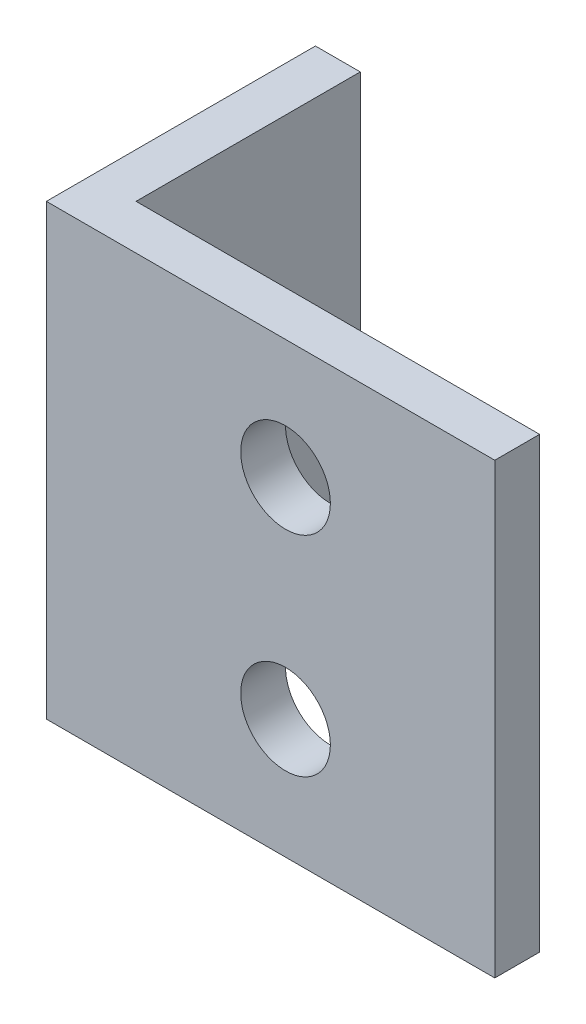
ISO-10303-21;
HEADER;
FILE_DESCRIPTION(('STEP AP214'),'2;1');
FILE_NAME('part.step','',(''),(''),'','','');
FILE_SCHEMA(('AUTOMOTIVE_DESIGN { 1 0 10303 214 1 1 1 1 }'));
ENDSEC;
DATA;
#1=APPLICATION_CONTEXT('core data for automotive mechanical design processes');
#2=APPLICATION_PROTOCOL_DEFINITION('international standard','automotive_design',2000,#1);
#3=PRODUCT_CONTEXT('',#1,'mechanical');
#4=PRODUCT('Part','Part','',(#3));
#5=PRODUCT_RELATED_PRODUCT_CATEGORY('part','',(#4));
#6=PRODUCT_DEFINITION_FORMATION('','',#4);
#7=PRODUCT_DEFINITION_CONTEXT('part definition',#1,'design');
#8=PRODUCT_DEFINITION('design','',#6,#7);
#9=PRODUCT_DEFINITION_SHAPE('','',#8);
#10=(LENGTH_UNIT() NAMED_UNIT(*) SI_UNIT(.MILLI.,.METRE.));
#11=(NAMED_UNIT(*) PLANE_ANGLE_UNIT() SI_UNIT($,.RADIAN.));
#12=(NAMED_UNIT(*) SI_UNIT($,.STERADIAN.) SOLID_ANGLE_UNIT());
#13=UNCERTAINTY_MEASURE_WITH_UNIT(LENGTH_MEASURE(1.E-05),#10,'distance_accuracy_value','');
#14=(GEOMETRIC_REPRESENTATION_CONTEXT(3) GLOBAL_UNCERTAINTY_ASSIGNED_CONTEXT((#13)) GLOBAL_UNIT_ASSIGNED_CONTEXT((#10,
#11,#12)) REPRESENTATION_CONTEXT('',''));
#15=CARTESIAN_POINT('',(0.,0.,0.));
#16=DIRECTION('',(0.,0.,1.));
#17=DIRECTION('',(1.,0.,0.));
#18=AXIS2_PLACEMENT_3D('',#15,#16,#17);
#19=CARTESIAN_POINT('',(-18.0197816219261,15.,0.));
#20=DIRECTION('',(0.,0.,-1.));
#21=DIRECTION('',(-1.,0.,0.));
#22=AXIS2_PLACEMENT_3D('',#19,#20,#21);
#23=PLANE('',#22);
#24=CARTESIAN_POINT('',(-25.0197816219261,4.,0.));
#25=DIRECTION('',(0.,0.,1.));
#26=DIRECTION('',(1.,0.,0.));
#27=AXIS2_PLACEMENT_3D('',#24,#25,#26);
#28=CIRCLE('',#27,1.5);
#29=CARTESIAN_POINT('',(-23.5197816219261,4.,0.));
#30=VERTEX_POINT('',#29);
#31=EDGE_CURVE('E142',#30,#30,#28,.T.);
#32=ORIENTED_EDGE('',*,*,#31,.F.);
#33=EDGE_LOOP('',(#32));
#34=FACE_BOUND('',#33,.T.);
#35=CARTESIAN_POINT('',(-25.0197816219261,11.,0.));
#36=DIRECTION('',(0.,0.,1.));
#37=DIRECTION('',(1.,0.,0.));
#38=AXIS2_PLACEMENT_3D('',#35,#36,#37);
#39=CIRCLE('',#38,1.5);
#40=CARTESIAN_POINT('',(-23.5197816219261,11.,0.));
#41=VERTEX_POINT('',#40);
#42=EDGE_CURVE('E134',#41,#41,#39,.T.);
#43=ORIENTED_EDGE('',*,*,#42,.F.);
#44=EDGE_LOOP('',(#43));
#45=FACE_BOUND('',#44,.T.);
#46=DIRECTION('',(1.,0.,0.));
#47=VECTOR('',#46,1.);
#48=CARTESIAN_POINT('',(-18.0197816219261,0.,0.));
#49=LINE('',#48,#47);
#50=CARTESIAN_POINT('',(-33.0197816219261,0.,0.));
#51=VERTEX_POINT('',#50);
#52=CARTESIAN_POINT('',(-18.0197816219261,0.,0.));
#53=VERTEX_POINT('',#52);
#54=EDGE_CURVE('E117',#51,#53,#49,.T.);
#55=ORIENTED_EDGE('',*,*,#54,.T.);
#56=DIRECTION('',(0.,-1.,0.));
#57=VECTOR('',#56,1.);
#58=CARTESIAN_POINT('',(-18.0197816219261,15.,0.));
#59=LINE('',#58,#57);
#60=CARTESIAN_POINT('',(-18.0197816219261,15.,0.));
#61=VERTEX_POINT('',#60);
#62=EDGE_CURVE('E11',#61,#53,#59,.T.);
#63=ORIENTED_EDGE('',*,*,#62,.F.);
#64=DIRECTION('',(1.,0.,0.));
#65=VECTOR('',#64,1.);
#66=CARTESIAN_POINT('',(-18.0197816219261,15.,0.));
#67=LINE('',#66,#65);
#68=CARTESIAN_POINT('',(-33.0197816219261,15.,0.));
#69=VERTEX_POINT('',#68);
#70=EDGE_CURVE('E128',#69,#61,#67,.T.);
#71=ORIENTED_EDGE('',*,*,#70,.F.);
#72=DIRECTION('',(0.,-1.,0.));
#73=VECTOR('',#72,1.);
#74=CARTESIAN_POINT('',(-33.0197816219261,15.,0.));
#75=LINE('',#74,#73);
#76=EDGE_CURVE('E113',#69,#51,#75,.T.);
#77=ORIENTED_EDGE('',*,*,#76,.T.);
#78=EDGE_LOOP('',(#55,#63,#71,#77));
#79=FACE_BOUND('',#78,.T.);
#80=ADVANCED_FACE('F31',(#34,#45,#79),#23,.F.);
#81=CARTESIAN_POINT('',(-18.0197816219261,15.,-1.5));
#82=DIRECTION('',(-1.,0.,0.));
#83=DIRECTION('',(0.,0.,1.));
#84=AXIS2_PLACEMENT_3D('',#81,#82,#83);
#85=PLANE('',#84);
#86=DIRECTION('',(0.,0.,-1.));
#87=VECTOR('',#86,1.);
#88=CARTESIAN_POINT('',(-18.0197816219261,0.,-1.5));
#89=LINE('',#88,#87);
#90=CARTESIAN_POINT('',(-18.0197816219261,0.,-1.5));
#91=VERTEX_POINT('',#90);
#92=EDGE_CURVE('E120',#53,#91,#89,.T.);
#93=ORIENTED_EDGE('',*,*,#92,.T.);
#94=DIRECTION('',(0.,-1.,0.));
#95=VECTOR('',#94,1.);
#96=CARTESIAN_POINT('',(-18.0197816219261,15.,-1.5));
#97=LINE('',#96,#95);
#98=CARTESIAN_POINT('',(-18.0197816219261,15.,-1.5));
#99=VERTEX_POINT('',#98);
#100=EDGE_CURVE('E40',#99,#91,#97,.T.);
#101=ORIENTED_EDGE('',*,*,#100,.F.);
#102=DIRECTION('',(0.,0.,-1.));
#103=VECTOR('',#102,1.);
#104=CARTESIAN_POINT('',(-18.0197816219261,15.,-1.5));
#105=LINE('',#104,#103);
#106=EDGE_CURVE('E86',#61,#99,#105,.T.);
#107=ORIENTED_EDGE('',*,*,#106,.F.);
#108=ORIENTED_EDGE('',*,*,#62,.T.);
#109=EDGE_LOOP('',(#93,#101,#107,#108));
#110=FACE_BOUND('',#109,.T.);
#111=ADVANCED_FACE('F148',(#110),#85,.F.);
#112=CARTESIAN_POINT('',(-31.5197816219261,15.,-1.5));
#113=DIRECTION('',(0.,0.,1.));
#114=DIRECTION('',(1.,0.,0.));
#115=AXIS2_PLACEMENT_3D('',#112,#113,#114);
#116=PLANE('',#115);
#117=CARTESIAN_POINT('',(-25.0197816219261,4.,-1.5));
#118=DIRECTION('',(0.,0.,1.));
#119=DIRECTION('',(1.,0.,0.));
#120=AXIS2_PLACEMENT_3D('',#117,#118,#119);
#121=CIRCLE('',#120,1.5);
#122=CARTESIAN_POINT('',(-23.5197816219261,4.,-1.5));
#123=VERTEX_POINT('',#122);
#124=EDGE_CURVE('E34',#123,#123,#121,.T.);
#125=ORIENTED_EDGE('',*,*,#124,.T.);
#126=EDGE_LOOP('',(#125));
#127=FACE_BOUND('',#126,.T.);
#128=CARTESIAN_POINT('',(-25.0197816219261,11.,-1.5));
#129=DIRECTION('',(0.,0.,1.));
#130=DIRECTION('',(1.,0.,0.));
#131=AXIS2_PLACEMENT_3D('',#128,#129,#130);
#132=CIRCLE('',#131,1.5);
#133=CARTESIAN_POINT('',(-23.5197816219261,11.,-1.5));
#134=VERTEX_POINT('',#133);
#135=EDGE_CURVE('E121',#134,#134,#132,.T.);
#136=ORIENTED_EDGE('',*,*,#135,.T.);
#137=EDGE_LOOP('',(#136));
#138=FACE_BOUND('',#137,.T.);
#139=DIRECTION('',(-1.,0.,0.));
#140=VECTOR('',#139,1.);
#141=CARTESIAN_POINT('',(-31.5197816219261,0.,-1.5));
#142=LINE('',#141,#140);
#143=CARTESIAN_POINT('',(-31.5197816219261,0.,-1.5));
#144=VERTEX_POINT('',#143);
#145=EDGE_CURVE('E123',#91,#144,#142,.T.);
#146=ORIENTED_EDGE('',*,*,#145,.T.);
#147=DIRECTION('',(0.,-1.,0.));
#148=VECTOR('',#147,1.);
#149=CARTESIAN_POINT('',(-31.5197816219261,15.,-1.5));
#150=LINE('',#149,#148);
#151=CARTESIAN_POINT('',(-31.5197816219261,15.,-1.5));
#152=VERTEX_POINT('',#151);
#153=EDGE_CURVE('E108',#152,#144,#150,.T.);
#154=ORIENTED_EDGE('',*,*,#153,.F.);
#155=DIRECTION('',(-1.,0.,0.));
#156=VECTOR('',#155,1.);
#157=CARTESIAN_POINT('',(-31.5197816219261,15.,-1.5));
#158=LINE('',#157,#156);
#159=EDGE_CURVE('E99',#99,#152,#158,.T.);
#160=ORIENTED_EDGE('',*,*,#159,.F.);
#161=ORIENTED_EDGE('',*,*,#100,.T.);
#162=EDGE_LOOP('',(#146,#154,#160,#161));
#163=FACE_BOUND('',#162,.T.);
#164=ADVANCED_FACE('F151',(#127,#138,#163),#116,.F.);
#165=CARTESIAN_POINT('',(-31.5197816219261,15.,-9.));
#166=DIRECTION('',(-1.,0.,0.));
#167=DIRECTION('',(0.,0.,1.));
#168=AXIS2_PLACEMENT_3D('',#165,#166,#167);
#169=PLANE('',#168);
#170=DIRECTION('',(0.,0.,-1.));
#171=VECTOR('',#170,1.);
#172=CARTESIAN_POINT('',(-31.5197816219261,0.,-9.));
#173=LINE('',#172,#171);
#174=CARTESIAN_POINT('',(-31.5197816219261,0.,-9.));
#175=VERTEX_POINT('',#174);
#176=EDGE_CURVE('E107',#144,#175,#173,.T.);
#177=ORIENTED_EDGE('',*,*,#176,.T.);
#178=DIRECTION('',(0.,-1.,0.));
#179=VECTOR('',#178,1.);
#180=CARTESIAN_POINT('',(-31.5197816219261,15.,-9.));
#181=LINE('',#180,#179);
#182=CARTESIAN_POINT('',(-31.5197816219261,15.,-9.));
#183=VERTEX_POINT('',#182);
#184=EDGE_CURVE('E104',#183,#175,#181,.T.);
#185=ORIENTED_EDGE('',*,*,#184,.F.);
#186=DIRECTION('',(0.,0.,-1.));
#187=VECTOR('',#186,1.);
#188=CARTESIAN_POINT('',(-31.5197816219261,15.,-9.));
#189=LINE('',#188,#187);
#190=EDGE_CURVE('E93',#152,#183,#189,.T.);
#191=ORIENTED_EDGE('',*,*,#190,.F.);
#192=ORIENTED_EDGE('',*,*,#153,.T.);
#193=EDGE_LOOP('',(#177,#185,#191,#192));
#194=FACE_BOUND('',#193,.T.);
#195=ADVANCED_FACE('F105',(#194),#169,.F.);
#196=CARTESIAN_POINT('',(-33.0197816219261,15.,-9.));
#197=DIRECTION('',(0.,0.,1.));
#198=DIRECTION('',(1.,0.,0.));
#199=AXIS2_PLACEMENT_3D('',#196,#197,#198);
#200=PLANE('',#199);
#201=DIRECTION('',(-1.,0.,0.));
#202=VECTOR('',#201,1.);
#203=CARTESIAN_POINT('',(-33.0197816219261,0.,-9.));
#204=LINE('',#203,#202);
#205=CARTESIAN_POINT('',(-33.0197816219261,0.,-9.));
#206=VERTEX_POINT('',#205);
#207=EDGE_CURVE('E72',#175,#206,#204,.T.);
#208=ORIENTED_EDGE('',*,*,#207,.T.);
#209=DIRECTION('',(0.,-1.,0.));
#210=VECTOR('',#209,1.);
#211=CARTESIAN_POINT('',(-33.0197816219261,15.,-9.));
#212=LINE('',#211,#210);
#213=CARTESIAN_POINT('',(-33.0197816219261,15.,-9.));
#214=VERTEX_POINT('',#213);
#215=EDGE_CURVE('E109',#214,#206,#212,.T.);
#216=ORIENTED_EDGE('',*,*,#215,.F.);
#217=DIRECTION('',(-1.,0.,0.));
#218=VECTOR('',#217,1.);
#219=CARTESIAN_POINT('',(-33.0197816219261,15.,-9.));
#220=LINE('',#219,#218);
#221=EDGE_CURVE('E97',#183,#214,#220,.T.);
#222=ORIENTED_EDGE('',*,*,#221,.F.);
#223=ORIENTED_EDGE('',*,*,#184,.T.);
#224=EDGE_LOOP('',(#208,#216,#222,#223));
#225=FACE_BOUND('',#224,.T.);
#226=ADVANCED_FACE('F111',(#225),#200,.F.);
#227=CARTESIAN_POINT('',(-33.0197816219261,15.,0.));
#228=DIRECTION('',(1.,0.,0.));
#229=DIRECTION('',(0.,0.,-1.));
#230=AXIS2_PLACEMENT_3D('',#227,#228,#229);
#231=PLANE('',#230);
#232=DIRECTION('',(0.,0.,1.));
#233=VECTOR('',#232,1.);
#234=CARTESIAN_POINT('',(-33.0197816219261,0.,0.));
#235=LINE('',#234,#233);
#236=EDGE_CURVE('E78',#206,#51,#235,.T.);
#237=ORIENTED_EDGE('',*,*,#236,.T.);
#238=ORIENTED_EDGE('',*,*,#76,.F.);
#239=DIRECTION('',(0.,0.,1.));
#240=VECTOR('',#239,1.);
#241=CARTESIAN_POINT('',(-33.0197816219261,15.,0.));
#242=LINE('',#241,#240);
#243=EDGE_CURVE('E49',#214,#69,#242,.T.);
#244=ORIENTED_EDGE('',*,*,#243,.F.);
#245=ORIENTED_EDGE('',*,*,#215,.T.);
#246=EDGE_LOOP('',(#237,#238,#244,#245));
#247=FACE_BOUND('',#246,.T.);
#248=ADVANCED_FACE('F156',(#247),#231,.F.);
#249=CARTESIAN_POINT('',(-33.0197816219261,15.,0.));
#250=DIRECTION('',(0.,-1.,0.));
#251=DIRECTION('',(0.,0.,-1.));
#252=AXIS2_PLACEMENT_3D('',#249,#250,#251);
#253=PLANE('',#252);
#254=ORIENTED_EDGE('',*,*,#70,.T.);
#255=ORIENTED_EDGE('',*,*,#106,.T.);
#256=ORIENTED_EDGE('',*,*,#159,.T.);
#257=ORIENTED_EDGE('',*,*,#190,.T.);
#258=ORIENTED_EDGE('',*,*,#221,.T.);
#259=ORIENTED_EDGE('',*,*,#243,.T.);
#260=EDGE_LOOP('',(#254,#255,#256,#257,#258,#259));
#261=FACE_BOUND('',#260,.T.);
#262=ADVANCED_FACE('F95',(#261),#253,.F.);
#263=CARTESIAN_POINT('',(-33.0197816219261,0.,0.));
#264=DIRECTION('',(0.,-1.,0.));
#265=DIRECTION('',(0.,0.,-1.));
#266=AXIS2_PLACEMENT_3D('',#263,#264,#265);
#267=PLANE('',#266);
#268=ORIENTED_EDGE('',*,*,#54,.F.);
#269=ORIENTED_EDGE('',*,*,#236,.F.);
#270=ORIENTED_EDGE('',*,*,#207,.F.);
#271=ORIENTED_EDGE('',*,*,#176,.F.);
#272=ORIENTED_EDGE('',*,*,#145,.F.);
#273=ORIENTED_EDGE('',*,*,#92,.F.);
#274=EDGE_LOOP('',(#268,#269,#270,#271,#272,#273));
#275=FACE_BOUND('',#274,.T.);
#276=ADVANCED_FACE('F154',(#275),#267,.T.);
#277=CARTESIAN_POINT('',(-25.0197816219261,11.,-15.));
#278=DIRECTION('',(0.,0.,1.));
#279=DIRECTION('',(1.,0.,0.));
#280=AXIS2_PLACEMENT_3D('',#277,#278,#279);
#281=CYLINDRICAL_SURFACE('',#280,1.5);
#282=ORIENTED_EDGE('',*,*,#42,.T.);
#283=EDGE_LOOP('',(#282));
#284=FACE_BOUND('',#283,.T.);
#285=ORIENTED_EDGE('',*,*,#135,.F.);
#286=EDGE_LOOP('',(#285));
#287=FACE_BOUND('',#286,.T.);
#288=ADVANCED_FACE('F178',(#284,#287),#281,.F.);
#289=CARTESIAN_POINT('',(-25.0197816219261,4.,-15.));
#290=DIRECTION('',(0.,0.,1.));
#291=DIRECTION('',(1.,0.,0.));
#292=AXIS2_PLACEMENT_3D('',#289,#290,#291);
#293=CYLINDRICAL_SURFACE('',#292,1.5);
#294=ORIENTED_EDGE('',*,*,#31,.T.);
#295=EDGE_LOOP('',(#294));
#296=FACE_BOUND('',#295,.T.);
#297=ORIENTED_EDGE('',*,*,#124,.F.);
#298=EDGE_LOOP('',(#297));
#299=FACE_BOUND('',#298,.T.);
#300=ADVANCED_FACE('F175',(#296,#299),#293,.F.);
#301=CLOSED_SHELL('',(#80,#111,#164,#195,#226,#248,#262,#276,#288,#300));
#302=MANIFOLD_SOLID_BREP('B2',#301);
#303=ADVANCED_BREP_SHAPE_REPRESENTATION('',(#18,#302),#14);
#304=SHAPE_DEFINITION_REPRESENTATION(#9,#303);
ENDSEC;
END-ISO-10303-21;
